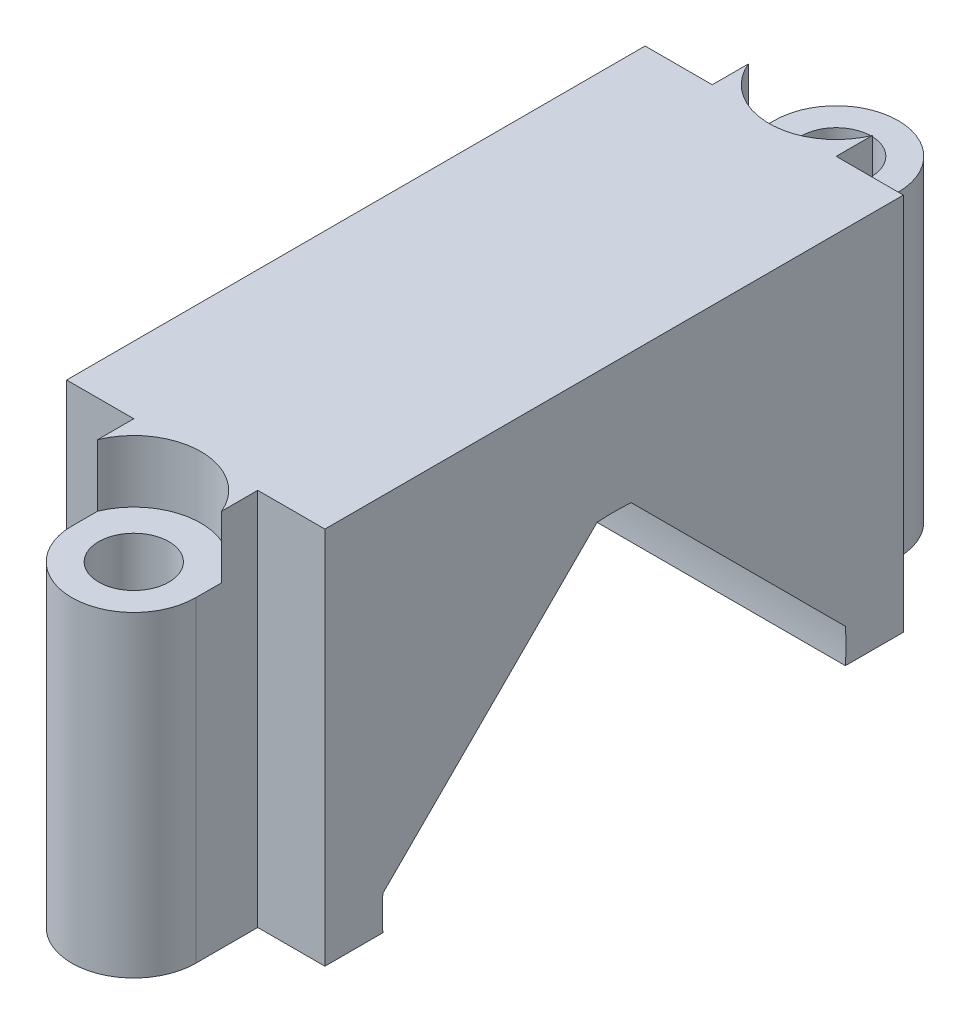
ISO-10303-21;
HEADER;
FILE_DESCRIPTION(('STEP AP214'),'2;1');
FILE_NAME('part.step','',(''),(''),'','','');
FILE_SCHEMA(('AUTOMOTIVE_DESIGN { 1 0 10303 214 1 1 1 1 }'));
ENDSEC;
DATA;
#1=APPLICATION_CONTEXT('core data for automotive mechanical design processes');
#2=APPLICATION_PROTOCOL_DEFINITION('international standard','automotive_design',2000,#1);
#3=PRODUCT_CONTEXT('',#1,'mechanical');
#4=PRODUCT('Part','Part','',(#3));
#5=PRODUCT_RELATED_PRODUCT_CATEGORY('part','',(#4));
#6=PRODUCT_DEFINITION_FORMATION('','',#4);
#7=PRODUCT_DEFINITION_CONTEXT('part definition',#1,'design');
#8=PRODUCT_DEFINITION('design','',#6,#7);
#9=PRODUCT_DEFINITION_SHAPE('','',#8);
#10=(LENGTH_UNIT() NAMED_UNIT(*) SI_UNIT(.MILLI.,.METRE.));
#11=(NAMED_UNIT(*) PLANE_ANGLE_UNIT() SI_UNIT($,.RADIAN.));
#12=(NAMED_UNIT(*) SI_UNIT($,.STERADIAN.) SOLID_ANGLE_UNIT());
#13=UNCERTAINTY_MEASURE_WITH_UNIT(LENGTH_MEASURE(1.E-05),#10,'distance_accuracy_value','');
#14=(GEOMETRIC_REPRESENTATION_CONTEXT(3) GLOBAL_UNCERTAINTY_ASSIGNED_CONTEXT((#13)) GLOBAL_UNIT_ASSIGNED_CONTEXT((#10,
#11,#12)) REPRESENTATION_CONTEXT('',''));
#15=CARTESIAN_POINT('',(0.,0.,0.));
#16=DIRECTION('',(0.,0.,1.));
#17=DIRECTION('',(1.,0.,0.));
#18=AXIS2_PLACEMENT_3D('',#15,#16,#17);
#19=CARTESIAN_POINT('',(0.,11.673732838335,0.));
#20=DIRECTION('',(0.,1.,0.));
#21=DIRECTION('',(0.,0.,1.));
#22=AXIS2_PLACEMENT_3D('',#19,#20,#21);
#23=PLANE('',#22);
#24=CARTESIAN_POINT('',(-58.75,11.673732838335,-40.75));
#25=DIRECTION('',(0.,1.,0.));
#26=DIRECTION('',(0.,0.,1.));
#27=AXIS2_PLACEMENT_3D('',#24,#25,#26);
#28=CIRCLE('',#27,1.69999999999999);
#29=CARTESIAN_POINT('',(-58.75,11.673732838335,-39.05));
#30=VERTEX_POINT('',#29);
#31=EDGE_CURVE('E46',#30,#30,#28,.T.);
#32=ORIENTED_EDGE('',*,*,#31,.T.);
#33=EDGE_LOOP('',(#32));
#34=FACE_BOUND('',#33,.T.);
#35=DIRECTION('',(0.,0.,1.));
#36=VECTOR('',#35,1.);
#37=CARTESIAN_POINT('',(-52.5,11.673732838335,0.));
#38=LINE('',#37,#36);
#39=CARTESIAN_POINT('',(-52.5,11.673732838335,-46.5554518814936));
#40=VERTEX_POINT('',#39);
#41=CARTESIAN_POINT('',(-52.5,11.673732838335,-43.75));
#42=VERTEX_POINT('',#41);
#43=EDGE_CURVE('E281',#40,#42,#38,.T.);
#44=ORIENTED_EDGE('',*,*,#43,.T.);
#45=DIRECTION('',(1.,0.,0.));
#46=VECTOR('',#45,1.);
#47=CARTESIAN_POINT('',(0.,11.673732838335,-43.75));
#48=LINE('',#47,#46);
#49=CARTESIAN_POINT('',(-55.75,11.673732838335,-43.75));
#50=VERTEX_POINT('',#49);
#51=EDGE_CURVE('E294',#50,#42,#48,.T.);
#52=ORIENTED_EDGE('',*,*,#51,.F.);
#53=DIRECTION('',(0.,0.,-1.));
#54=VECTOR('',#53,1.);
#55=CARTESIAN_POINT('',(-55.75,11.673732838335,0.));
#56=LINE('',#55,#54);
#57=CARTESIAN_POINT('',(-55.75,11.673732838335,-40.75));
#58=VERTEX_POINT('',#57);
#59=EDGE_CURVE('E292',#58,#50,#56,.T.);
#60=ORIENTED_EDGE('',*,*,#59,.F.);
#61=CARTESIAN_POINT('',(-58.75,11.673732838335,-40.75));
#62=DIRECTION('',(0.,1.,0.));
#63=DIRECTION('',(0.,0.,1.));
#64=AXIS2_PLACEMENT_3D('',#61,#62,#63);
#65=CIRCLE('',#64,3.);
#66=CARTESIAN_POINT('',(-61.75,11.673732838335,-40.75));
#67=VERTEX_POINT('',#66);
#68=EDGE_CURVE('E289',#67,#58,#65,.T.);
#69=ORIENTED_EDGE('',*,*,#68,.F.);
#70=DIRECTION('',(0.,0.,1.));
#71=VECTOR('',#70,1.);
#72=CARTESIAN_POINT('',(-61.75,11.673732838335,0.));
#73=LINE('',#72,#71);
#74=CARTESIAN_POINT('',(-61.75,11.673732838335,-43.75));
#75=VERTEX_POINT('',#74);
#76=EDGE_CURVE('E286',#75,#67,#73,.T.);
#77=ORIENTED_EDGE('',*,*,#76,.F.);
#78=DIRECTION('',(1.,0.,0.));
#79=VECTOR('',#78,1.);
#80=CARTESIAN_POINT('',(0.,11.673732838335,-43.75));
#81=LINE('',#80,#79);
#82=CARTESIAN_POINT('',(-65.,11.673732838335,-43.75));
#83=VERTEX_POINT('',#82);
#84=EDGE_CURVE('E268',#83,#75,#81,.T.);
#85=ORIENTED_EDGE('',*,*,#84,.F.);
#86=DIRECTION('',(0.,0.,1.));
#87=VECTOR('',#86,1.);
#88=CARTESIAN_POINT('',(-65.,11.673732838335,0.));
#89=LINE('',#88,#87);
#90=CARTESIAN_POINT('',(-65.,11.673732838335,-46.5554518814936));
#91=VERTEX_POINT('',#90);
#92=EDGE_CURVE('E269',#91,#83,#89,.T.);
#93=ORIENTED_EDGE('',*,*,#92,.F.);
#94=DIRECTION('',(-1.,0.,0.));
#95=VECTOR('',#94,1.);
#96=CARTESIAN_POINT('',(-45.07,11.673732838335,-46.5554518814936));
#97=LINE('',#96,#95);
#98=EDGE_CURVE('E338',#40,#91,#97,.T.);
#99=ORIENTED_EDGE('',*,*,#98,.F.);
#100=EDGE_LOOP('',(#44,#52,#60,#69,#77,#85,#93,#99));
#101=FACE_BOUND('',#100,.T.);
#102=ADVANCED_FACE('F42',(#34,#101),#23,.F.);
#103=CARTESIAN_POINT('',(-58.75,11.673732838335,-74.75));
#104=DIRECTION('',(0.,1.,0.));
#105=DIRECTION('',(0.,0.,1.));
#106=AXIS2_PLACEMENT_3D('',#103,#104,#105);
#107=CIRCLE('',#106,1.69999999999999);
#108=CARTESIAN_POINT('',(-58.75,11.673732838335,-73.05));
#109=VERTEX_POINT('',#108);
#110=EDGE_CURVE('E300',#109,#109,#107,.T.);
#111=ORIENTED_EDGE('',*,*,#110,.T.);
#112=EDGE_LOOP('',(#111));
#113=FACE_BOUND('',#112,.T.);
#114=CARTESIAN_POINT('',(-52.5,11.673732838335,-71.75));
#115=VERTEX_POINT('',#114);
#116=CARTESIAN_POINT('',(-52.5,11.673732838335,-68.9445481185063));
#117=VERTEX_POINT('',#116);
#118=EDGE_CURVE('E284',#115,#117,#38,.T.);
#119=ORIENTED_EDGE('',*,*,#118,.T.);
#120=DIRECTION('',(-1.,0.,0.));
#121=VECTOR('',#120,1.);
#122=CARTESIAN_POINT('',(-60.94,11.673732838335,-68.9445481185063));
#123=LINE('',#122,#121);
#124=CARTESIAN_POINT('',(-65.,11.673732838335,-68.9445481185063));
#125=VERTEX_POINT('',#124);
#126=EDGE_CURVE('E261',#117,#125,#123,.T.);
#127=ORIENTED_EDGE('',*,*,#126,.T.);
#128=CARTESIAN_POINT('',(-65.,11.673732838335,-71.75));
#129=VERTEX_POINT('',#128);
#130=EDGE_CURVE('E266',#129,#125,#89,.T.);
#131=ORIENTED_EDGE('',*,*,#130,.F.);
#132=DIRECTION('',(1.,0.,0.));
#133=VECTOR('',#132,1.);
#134=CARTESIAN_POINT('',(0.,11.673732838335,-71.75));
#135=LINE('',#134,#133);
#136=CARTESIAN_POINT('',(-61.75,11.673732838335,-71.75));
#137=VERTEX_POINT('',#136);
#138=EDGE_CURVE('E265',#129,#137,#135,.T.);
#139=ORIENTED_EDGE('',*,*,#138,.T.);
#140=DIRECTION('',(0.,0.,1.));
#141=VECTOR('',#140,1.);
#142=CARTESIAN_POINT('',(-61.75,11.673732838335,0.));
#143=LINE('',#142,#141);
#144=CARTESIAN_POINT('',(-61.75,11.673732838335,-74.75));
#145=VERTEX_POINT('',#144);
#146=EDGE_CURVE('E273',#145,#137,#143,.T.);
#147=ORIENTED_EDGE('',*,*,#146,.F.);
#148=CARTESIAN_POINT('',(-58.75,11.673732838335,-74.75));
#149=DIRECTION('',(0.,1.,0.));
#150=DIRECTION('',(0.,0.,1.));
#151=AXIS2_PLACEMENT_3D('',#148,#149,#150);
#152=CIRCLE('',#151,3.);
#153=CARTESIAN_POINT('',(-55.75,11.673732838335,-74.75));
#154=VERTEX_POINT('',#153);
#155=EDGE_CURVE('E275',#154,#145,#152,.T.);
#156=ORIENTED_EDGE('',*,*,#155,.F.);
#157=DIRECTION('',(0.,0.,-1.));
#158=VECTOR('',#157,1.);
#159=CARTESIAN_POINT('',(-55.75,11.673732838335,0.));
#160=LINE('',#159,#158);
#161=CARTESIAN_POINT('',(-55.75,11.673732838335,-71.75));
#162=VERTEX_POINT('',#161);
#163=EDGE_CURVE('E260',#162,#154,#160,.T.);
#164=ORIENTED_EDGE('',*,*,#163,.F.);
#165=DIRECTION('',(1.,0.,0.));
#166=VECTOR('',#165,1.);
#167=CARTESIAN_POINT('',(0.,11.673732838335,-71.75));
#168=LINE('',#167,#166);
#169=EDGE_CURVE('E272',#162,#115,#168,.T.);
#170=ORIENTED_EDGE('',*,*,#169,.T.);
#171=EDGE_LOOP('',(#119,#127,#131,#139,#147,#156,#164,#170));
#172=FACE_BOUND('',#171,.T.);
#173=ADVANCED_FACE('F44',(#113,#172),#23,.F.);
#174=CARTESIAN_POINT('',(-52.5,71.9076365356005,0.));
#175=DIRECTION('',(1.,0.,0.));
#176=DIRECTION('',(0.,0.,-1.));
#177=AXIS2_PLACEMENT_3D('',#174,#175,#176);
#178=PLANE('',#177);
#179=ORIENTED_EDGE('',*,*,#118,.F.);
#180=DIRECTION('',(0.,-1.,0.));
#181=VECTOR('',#180,1.);
#182=CARTESIAN_POINT('',(-52.5,71.9076365356005,-71.75));
#183=LINE('',#182,#181);
#184=CARTESIAN_POINT('',(-52.5,30.,-71.75));
#185=VERTEX_POINT('',#184);
#186=EDGE_CURVE('E225',#185,#115,#183,.T.);
#187=ORIENTED_EDGE('',*,*,#186,.F.);
#188=DIRECTION('',(0.,0.,1.));
#189=VECTOR('',#188,1.);
#190=CARTESIAN_POINT('',(-52.5,30.,0.));
#191=LINE('',#190,#189);
#192=CARTESIAN_POINT('',(-52.5,30.,-43.75));
#193=VERTEX_POINT('',#192);
#194=EDGE_CURVE('E221',#185,#193,#191,.T.);
#195=ORIENTED_EDGE('',*,*,#194,.T.);
#196=DIRECTION('',(0.,-1.,0.));
#197=VECTOR('',#196,1.);
#198=CARTESIAN_POINT('',(-52.5,71.9076365356005,-43.75));
#199=LINE('',#198,#197);
#200=EDGE_CURVE('E224',#193,#42,#199,.T.);
#201=ORIENTED_EDGE('',*,*,#200,.T.);
#202=ORIENTED_EDGE('',*,*,#43,.F.);
#203=CARTESIAN_POINT('',(-52.5,12.5,-57.75));
#204=DIRECTION('',(1.,0.,0.));
#205=DIRECTION('',(0.,0.,-1.));
#206=AXIS2_PLACEMENT_3D('',#203,#204,#205);
#207=CIRCLE('',#206,11.225);
#208=CARTESIAN_POINT('',(-52.5,13.3262671616649,-46.5554518814936));
#209=VERTEX_POINT('',#208);
#210=EDGE_CURVE('E359',#40,#209,#207,.F.);
#211=ORIENTED_EDGE('',*,*,#210,.T.);
#212=DIRECTION('',(0.,0.707106781186547,-0.707106781186548));
#213=VECTOR('',#212,1.);
#214=CARTESIAN_POINT('',(-52.5,19.3392259078859,-52.5684106277146));
#215=LINE('',#214,#213);
#216=CARTESIAN_POINT('',(-52.5,23.6945481185063,-56.923732838335));
#217=VERTEX_POINT('',#216);
#218=EDGE_CURVE('E257',#209,#217,#215,.T.);
#219=ORIENTED_EDGE('',*,*,#218,.T.);
#220=CARTESIAN_POINT('',(-52.5,23.6945481185064,-58.576267161665));
#221=VERTEX_POINT('',#220);
#222=EDGE_CURVE('E358',#217,#221,#207,.F.);
#223=ORIENTED_EDGE('',*,*,#222,.T.);
#224=DIRECTION('',(0.,0.707106781186548,0.707106781186548));
#225=VECTOR('',#224,1.);
#226=CARTESIAN_POINT('',(-52.5,77.0892259078859,-5.18158937228538));
#227=LINE('',#226,#225);
#228=CARTESIAN_POINT('',(-52.5,13.326267161665,-68.9445481185063));
#229=VERTEX_POINT('',#228);
#230=EDGE_CURVE('E255',#229,#221,#227,.T.);
#231=ORIENTED_EDGE('',*,*,#230,.F.);
#232=EDGE_CURVE('E352',#229,#117,#207,.F.);
#233=ORIENTED_EDGE('',*,*,#232,.T.);
#234=EDGE_LOOP('',(#179,#187,#195,#201,#202,#211,#219,#223,#231,#233));
#235=FACE_BOUND('',#234,.T.);
#236=ADVANCED_FACE('F393',(#235),#178,.T.);
#237=CARTESIAN_POINT('',(0.,30.,0.));
#238=DIRECTION('',(0.,1.,0.));
#239=DIRECTION('',(0.,0.,1.));
#240=AXIS2_PLACEMENT_3D('',#237,#238,#239);
#241=PLANE('',#240);
#242=CARTESIAN_POINT('',(-58.75,30.,-40.75));
#243=DIRECTION('',(0.,1.,0.));
#244=DIRECTION('',(0.,0.,1.));
#245=AXIS2_PLACEMENT_3D('',#242,#243,#244);
#246=CIRCLE('',#245,3.25);
#247=CARTESIAN_POINT('',(-55.75,30.,-42.));
#248=VERTEX_POINT('',#247);
#249=CARTESIAN_POINT('',(-61.75,30.,-42.));
#250=VERTEX_POINT('',#249);
#251=EDGE_CURVE('E58',#248,#250,#246,.T.);
#252=ORIENTED_EDGE('',*,*,#251,.F.);
#253=DIRECTION('',(0.,0.,-1.));
#254=VECTOR('',#253,1.);
#255=CARTESIAN_POINT('',(-55.75,30.,0.));
#256=LINE('',#255,#254);
#257=CARTESIAN_POINT('',(-55.75,30.,-43.75));
#258=VERTEX_POINT('',#257);
#259=EDGE_CURVE('E204',#248,#258,#256,.T.);
#260=ORIENTED_EDGE('',*,*,#259,.T.);
#261=DIRECTION('',(1.,0.,0.));
#262=VECTOR('',#261,1.);
#263=CARTESIAN_POINT('',(0.,30.,-43.75));
#264=LINE('',#263,#262);
#265=EDGE_CURVE('E213',#258,#193,#264,.T.);
#266=ORIENTED_EDGE('',*,*,#265,.T.);
#267=ORIENTED_EDGE('',*,*,#194,.F.);
#268=DIRECTION('',(1.,0.,0.));
#269=VECTOR('',#268,1.);
#270=CARTESIAN_POINT('',(0.,30.,-71.75));
#271=LINE('',#270,#269);
#272=CARTESIAN_POINT('',(-55.75,30.,-71.75));
#273=VERTEX_POINT('',#272);
#274=EDGE_CURVE('E215',#273,#185,#271,.T.);
#275=ORIENTED_EDGE('',*,*,#274,.F.);
#276=DIRECTION('',(0.,0.,-1.));
#277=VECTOR('',#276,1.);
#278=CARTESIAN_POINT('',(-55.75,30.,0.));
#279=LINE('',#278,#277);
#280=CARTESIAN_POINT('',(-55.75,30.,-73.5));
#281=VERTEX_POINT('',#280);
#282=EDGE_CURVE('E362',#273,#281,#279,.T.);
#283=ORIENTED_EDGE('',*,*,#282,.T.);
#284=CARTESIAN_POINT('',(-58.75,30.,-74.75));
#285=DIRECTION('',(0.,1.,0.));
#286=DIRECTION('',(0.,0.,1.));
#287=AXIS2_PLACEMENT_3D('',#284,#285,#286);
#288=CIRCLE('',#287,3.25);
#289=CARTESIAN_POINT('',(-61.75,30.,-73.5));
#290=VERTEX_POINT('',#289);
#291=EDGE_CURVE('E66',#290,#281,#288,.T.);
#292=ORIENTED_EDGE('',*,*,#291,.F.);
#293=DIRECTION('',(0.,0.,1.));
#294=VECTOR('',#293,1.);
#295=CARTESIAN_POINT('',(-61.75,30.,0.));
#296=LINE('',#295,#294);
#297=CARTESIAN_POINT('',(-61.75,30.,-71.75));
#298=VERTEX_POINT('',#297);
#299=EDGE_CURVE('E365',#290,#298,#296,.T.);
#300=ORIENTED_EDGE('',*,*,#299,.T.);
#301=DIRECTION('',(1.,0.,0.));
#302=VECTOR('',#301,1.);
#303=CARTESIAN_POINT('',(0.,30.,-71.75));
#304=LINE('',#303,#302);
#305=CARTESIAN_POINT('',(-65.,30.,-71.75));
#306=VERTEX_POINT('',#305);
#307=EDGE_CURVE('E234',#306,#298,#304,.T.);
#308=ORIENTED_EDGE('',*,*,#307,.F.);
#309=DIRECTION('',(0.,0.,1.));
#310=VECTOR('',#309,1.);
#311=CARTESIAN_POINT('',(-65.,30.,0.));
#312=LINE('',#311,#310);
#313=CARTESIAN_POINT('',(-65.,30.,-43.75));
#314=VERTEX_POINT('',#313);
#315=EDGE_CURVE('E367',#306,#314,#312,.T.);
#316=ORIENTED_EDGE('',*,*,#315,.T.);
#317=DIRECTION('',(1.,0.,0.));
#318=VECTOR('',#317,1.);
#319=CARTESIAN_POINT('',(0.,30.,-43.75));
#320=LINE('',#319,#318);
#321=CARTESIAN_POINT('',(-61.75,30.,-43.75));
#322=VERTEX_POINT('',#321);
#323=EDGE_CURVE('E217',#314,#322,#320,.T.);
#324=ORIENTED_EDGE('',*,*,#323,.T.);
#325=DIRECTION('',(0.,0.,1.));
#326=VECTOR('',#325,1.);
#327=CARTESIAN_POINT('',(-61.75,30.,0.));
#328=LINE('',#327,#326);
#329=EDGE_CURVE('E207',#322,#250,#328,.T.);
#330=ORIENTED_EDGE('',*,*,#329,.T.);
#331=EDGE_LOOP('',(#252,#260,#266,#267,#275,#283,#292,#300,#308,#316,#324,#330));
#332=FACE_BOUND('',#331,.T.);
#333=ADVANCED_FACE('F203',(#332),#241,.T.);
#334=CARTESIAN_POINT('',(0.,71.9076365356005,-71.75));
#335=DIRECTION('',(0.,0.,-1.));
#336=DIRECTION('',(-1.,0.,0.));
#337=AXIS2_PLACEMENT_3D('',#334,#335,#336);
#338=PLANE('',#337);
#339=ORIENTED_EDGE('',*,*,#169,.F.);
#340=DIRECTION('',(0.,-1.,0.));
#341=VECTOR('',#340,1.);
#342=CARTESIAN_POINT('',(-55.75,71.9076365356005,-71.75));
#343=LINE('',#342,#341);
#344=EDGE_CURVE('E228',#273,#162,#343,.T.);
#345=ORIENTED_EDGE('',*,*,#344,.F.);
#346=ORIENTED_EDGE('',*,*,#274,.T.);
#347=ORIENTED_EDGE('',*,*,#186,.T.);
#348=EDGE_LOOP('',(#339,#345,#346,#347));
#349=FACE_BOUND('',#348,.T.);
#350=ADVANCED_FACE('F397',(#349),#338,.T.);
#351=CARTESIAN_POINT('',(0.,71.9076365356005,-43.75));
#352=DIRECTION('',(0.,0.,-1.));
#353=DIRECTION('',(-1.,0.,0.));
#354=AXIS2_PLACEMENT_3D('',#351,#352,#353);
#355=PLANE('',#354);
#356=DIRECTION('',(0.,-1.,0.));
#357=VECTOR('',#356,1.);
#358=CARTESIAN_POINT('',(-55.75,71.9076365356005,-43.75));
#359=LINE('',#358,#357);
#360=EDGE_CURVE('E211',#258,#50,#359,.T.);
#361=ORIENTED_EDGE('',*,*,#360,.T.);
#362=ORIENTED_EDGE('',*,*,#51,.T.);
#363=ORIENTED_EDGE('',*,*,#200,.F.);
#364=ORIENTED_EDGE('',*,*,#265,.F.);
#365=EDGE_LOOP('',(#361,#362,#363,#364));
#366=FACE_BOUND('',#365,.T.);
#367=ADVANCED_FACE('F388',(#366),#355,.F.);
#368=CARTESIAN_POINT('',(-55.75,71.9076365356005,0.));
#369=DIRECTION('',(-1.,0.,0.));
#370=DIRECTION('',(0.,0.,1.));
#371=AXIS2_PLACEMENT_3D('',#368,#369,#370);
#372=PLANE('',#371);
#373=DIRECTION('',(0.,1.,0.));
#374=VECTOR('',#373,1.);
#375=CARTESIAN_POINT('',(-55.75,30.,-42.));
#376=LINE('',#375,#374);
#377=CARTESIAN_POINT('',(-55.75,27.,-42.));
#378=VERTEX_POINT('',#377);
#379=EDGE_CURVE('E191',#248,#378,#376,.F.);
#380=ORIENTED_EDGE('',*,*,#379,.T.);
#381=DIRECTION('',(0.,0.,1.));
#382=VECTOR('',#381,1.);
#383=CARTESIAN_POINT('',(-55.75,27.,0.));
#384=LINE('',#383,#382);
#385=CARTESIAN_POINT('',(-55.75,27.,-40.75));
#386=VERTEX_POINT('',#385);
#387=EDGE_CURVE('E311',#378,#386,#384,.T.);
#388=ORIENTED_EDGE('',*,*,#387,.T.);
#389=DIRECTION('',(0.,-1.,0.));
#390=VECTOR('',#389,1.);
#391=CARTESIAN_POINT('',(-55.75,71.9076365356005,-40.75));
#392=LINE('',#391,#390);
#393=EDGE_CURVE('E246',#386,#58,#392,.T.);
#394=ORIENTED_EDGE('',*,*,#393,.T.);
#395=ORIENTED_EDGE('',*,*,#59,.T.);
#396=ORIENTED_EDGE('',*,*,#360,.F.);
#397=ORIENTED_EDGE('',*,*,#259,.F.);
#398=EDGE_LOOP('',(#380,#388,#394,#395,#396,#397));
#399=FACE_BOUND('',#398,.T.);
#400=ADVANCED_FACE('F209',(#399),#372,.F.);
#401=CARTESIAN_POINT('',(-58.75,71.9076365356005,-40.75));
#402=DIRECTION('',(0.,-1.,0.));
#403=DIRECTION('',(0.,0.,-1.));
#404=AXIS2_PLACEMENT_3D('',#401,#402,#403);
#405=CYLINDRICAL_SURFACE('',#404,3.);
#406=ORIENTED_EDGE('',*,*,#393,.F.);
#407=CARTESIAN_POINT('',(-58.75,27.,-40.75));
#408=DIRECTION('',(0.,-1.,0.));
#409=DIRECTION('',(0.,0.,-1.));
#410=AXIS2_PLACEMENT_3D('',#407,#408,#409);
#411=CIRCLE('',#410,3.);
#412=CARTESIAN_POINT('',(-61.75,27.,-40.75));
#413=VERTEX_POINT('',#412);
#414=EDGE_CURVE('E198',#386,#413,#411,.T.);
#415=ORIENTED_EDGE('',*,*,#414,.T.);
#416=DIRECTION('',(0.,-1.,0.));
#417=VECTOR('',#416,1.);
#418=CARTESIAN_POINT('',(-61.75,71.9076365356005,-40.75));
#419=LINE('',#418,#417);
#420=EDGE_CURVE('E244',#413,#67,#419,.T.);
#421=ORIENTED_EDGE('',*,*,#420,.T.);
#422=ORIENTED_EDGE('',*,*,#68,.T.);
#423=EDGE_LOOP('',(#406,#415,#421,#422));
#424=FACE_BOUND('',#423,.T.);
#425=ADVANCED_FACE('F384',(#424),#405,.T.);
#426=CARTESIAN_POINT('',(-61.75,71.9076365356005,0.));
#427=DIRECTION('',(1.,0.,0.));
#428=DIRECTION('',(0.,0.,-1.));
#429=AXIS2_PLACEMENT_3D('',#426,#427,#428);
#430=PLANE('',#429);
#431=ORIENTED_EDGE('',*,*,#420,.F.);
#432=DIRECTION('',(0.,0.,-1.));
#433=VECTOR('',#432,1.);
#434=CARTESIAN_POINT('',(-61.75,27.,0.));
#435=LINE('',#434,#433);
#436=CARTESIAN_POINT('',(-61.75,27.,-42.));
#437=VERTEX_POINT('',#436);
#438=EDGE_CURVE('E11',#413,#437,#435,.T.);
#439=ORIENTED_EDGE('',*,*,#438,.T.);
#440=DIRECTION('',(0.,1.,0.));
#441=VECTOR('',#440,1.);
#442=CARTESIAN_POINT('',(-61.75,30.,-42.));
#443=LINE('',#442,#441);
#444=EDGE_CURVE('E51',#437,#250,#443,.T.);
#445=ORIENTED_EDGE('',*,*,#444,.T.);
#446=ORIENTED_EDGE('',*,*,#329,.F.);
#447=DIRECTION('',(0.,-1.,0.));
#448=VECTOR('',#447,1.);
#449=CARTESIAN_POINT('',(-61.75,71.9076365356005,-43.75));
#450=LINE('',#449,#448);
#451=EDGE_CURVE('E241',#322,#75,#450,.T.);
#452=ORIENTED_EDGE('',*,*,#451,.T.);
#453=ORIENTED_EDGE('',*,*,#76,.T.);
#454=EDGE_LOOP('',(#431,#439,#445,#446,#452,#453));
#455=FACE_BOUND('',#454,.T.);
#456=ADVANCED_FACE('F307',(#455),#430,.F.);
#457=CARTESIAN_POINT('',(0.,71.9076365356005,-43.75));
#458=DIRECTION('',(0.,0.,-1.));
#459=DIRECTION('',(-1.,0.,0.));
#460=AXIS2_PLACEMENT_3D('',#457,#458,#459);
#461=PLANE('',#460);
#462=DIRECTION('',(0.,-1.,0.));
#463=VECTOR('',#462,1.);
#464=CARTESIAN_POINT('',(-65.,71.9076365356005,-43.75));
#465=LINE('',#464,#463);
#466=EDGE_CURVE('E238',#314,#83,#465,.T.);
#467=ORIENTED_EDGE('',*,*,#466,.T.);
#468=ORIENTED_EDGE('',*,*,#84,.T.);
#469=ORIENTED_EDGE('',*,*,#451,.F.);
#470=ORIENTED_EDGE('',*,*,#323,.F.);
#471=EDGE_LOOP('',(#467,#468,#469,#470));
#472=FACE_BOUND('',#471,.T.);
#473=ADVANCED_FACE('F375',(#472),#461,.F.);
#474=CARTESIAN_POINT('',(-65.,71.9076365356005,0.));
#475=DIRECTION('',(1.,0.,0.));
#476=DIRECTION('',(0.,0.,-1.));
#477=AXIS2_PLACEMENT_3D('',#474,#475,#476);
#478=PLANE('',#477);
#479=DIRECTION('',(0.,-1.,0.));
#480=VECTOR('',#479,1.);
#481=CARTESIAN_POINT('',(-65.,71.9076365356005,-71.75));
#482=LINE('',#481,#480);
#483=EDGE_CURVE('E235',#306,#129,#482,.T.);
#484=ORIENTED_EDGE('',*,*,#483,.T.);
#485=ORIENTED_EDGE('',*,*,#130,.T.);
#486=CARTESIAN_POINT('',(-65.,12.5,-57.75));
#487=DIRECTION('',(1.,0.,0.));
#488=DIRECTION('',(0.,0.,-1.));
#489=AXIS2_PLACEMENT_3D('',#486,#487,#488);
#490=CIRCLE('',#489,11.225);
#491=EDGE_CURVE('E348',#125,#91,#490,.T.);
#492=ORIENTED_EDGE('',*,*,#491,.T.);
#493=ORIENTED_EDGE('',*,*,#92,.T.);
#494=ORIENTED_EDGE('',*,*,#466,.F.);
#495=ORIENTED_EDGE('',*,*,#315,.F.);
#496=EDGE_LOOP('',(#484,#485,#492,#493,#494,#495));
#497=FACE_BOUND('',#496,.T.);
#498=ADVANCED_FACE('F413',(#497),#478,.F.);
#499=CARTESIAN_POINT('',(0.,71.9076365356005,-71.75));
#500=DIRECTION('',(0.,0.,-1.));
#501=DIRECTION('',(-1.,0.,0.));
#502=AXIS2_PLACEMENT_3D('',#499,#500,#501);
#503=PLANE('',#502);
#504=ORIENTED_EDGE('',*,*,#138,.F.);
#505=ORIENTED_EDGE('',*,*,#483,.F.);
#506=ORIENTED_EDGE('',*,*,#307,.T.);
#507=DIRECTION('',(0.,-1.,0.));
#508=VECTOR('',#507,1.);
#509=CARTESIAN_POINT('',(-61.75,71.9076365356005,-71.75));
#510=LINE('',#509,#508);
#511=EDGE_CURVE('E231',#298,#137,#510,.T.);
#512=ORIENTED_EDGE('',*,*,#511,.T.);
#513=EDGE_LOOP('',(#504,#505,#506,#512));
#514=FACE_BOUND('',#513,.T.);
#515=ADVANCED_FACE('F410',(#514),#503,.T.);
#516=CARTESIAN_POINT('',(-61.75,71.9076365356005,0.));
#517=DIRECTION('',(1.,0.,0.));
#518=DIRECTION('',(0.,0.,-1.));
#519=AXIS2_PLACEMENT_3D('',#516,#517,#518);
#520=PLANE('',#519);
#521=DIRECTION('',(0.,1.,0.));
#522=VECTOR('',#521,1.);
#523=CARTESIAN_POINT('',(-61.75,30.,-73.5));
#524=LINE('',#523,#522);
#525=CARTESIAN_POINT('',(-61.75,27.,-73.5));
#526=VERTEX_POINT('',#525);
#527=EDGE_CURVE('E325',#290,#526,#524,.F.);
#528=ORIENTED_EDGE('',*,*,#527,.T.);
#529=DIRECTION('',(0.,0.,-1.));
#530=VECTOR('',#529,1.);
#531=CARTESIAN_POINT('',(-61.75,27.,0.));
#532=LINE('',#531,#530);
#533=CARTESIAN_POINT('',(-61.75,27.,-74.75));
#534=VERTEX_POINT('',#533);
#535=EDGE_CURVE('E304',#526,#534,#532,.T.);
#536=ORIENTED_EDGE('',*,*,#535,.T.);
#537=DIRECTION('',(0.,-1.,0.));
#538=VECTOR('',#537,1.);
#539=CARTESIAN_POINT('',(-61.75,71.9076365356005,-74.75));
#540=LINE('',#539,#538);
#541=EDGE_CURVE('E229',#534,#145,#540,.T.);
#542=ORIENTED_EDGE('',*,*,#541,.T.);
#543=ORIENTED_EDGE('',*,*,#146,.T.);
#544=ORIENTED_EDGE('',*,*,#511,.F.);
#545=ORIENTED_EDGE('',*,*,#299,.F.);
#546=EDGE_LOOP('',(#528,#536,#542,#543,#544,#545));
#547=FACE_BOUND('',#546,.T.);
#548=ADVANCED_FACE('F406',(#547),#520,.F.);
#549=CARTESIAN_POINT('',(-58.75,71.9076365356005,-74.75));
#550=DIRECTION('',(0.,-1.,0.));
#551=DIRECTION('',(0.,0.,-1.));
#552=AXIS2_PLACEMENT_3D('',#549,#550,#551);
#553=CYLINDRICAL_SURFACE('',#552,3.);
#554=ORIENTED_EDGE('',*,*,#541,.F.);
#555=CARTESIAN_POINT('',(-58.75,27.,-74.75));
#556=DIRECTION('',(0.,-1.,0.));
#557=DIRECTION('',(0.,0.,-1.));
#558=AXIS2_PLACEMENT_3D('',#555,#556,#557);
#559=CIRCLE('',#558,3.);
#560=CARTESIAN_POINT('',(-55.75,27.,-74.75));
#561=VERTEX_POINT('',#560);
#562=EDGE_CURVE('E328',#534,#561,#559,.T.);
#563=ORIENTED_EDGE('',*,*,#562,.T.);
#564=DIRECTION('',(0.,-1.,0.));
#565=VECTOR('',#564,1.);
#566=CARTESIAN_POINT('',(-55.75,71.9076365356005,-74.75));
#567=LINE('',#566,#565);
#568=EDGE_CURVE('E226',#561,#154,#567,.T.);
#569=ORIENTED_EDGE('',*,*,#568,.T.);
#570=ORIENTED_EDGE('',*,*,#155,.T.);
#571=EDGE_LOOP('',(#554,#563,#569,#570));
#572=FACE_BOUND('',#571,.T.);
#573=ADVANCED_FACE('F619',(#572),#553,.T.);
#574=CARTESIAN_POINT('',(-55.75,71.9076365356005,0.));
#575=DIRECTION('',(-1.,0.,0.));
#576=DIRECTION('',(0.,0.,1.));
#577=AXIS2_PLACEMENT_3D('',#574,#575,#576);
#578=PLANE('',#577);
#579=ORIENTED_EDGE('',*,*,#568,.F.);
#580=DIRECTION('',(0.,0.,1.));
#581=VECTOR('',#580,1.);
#582=CARTESIAN_POINT('',(-55.75,27.,0.));
#583=LINE('',#582,#581);
#584=CARTESIAN_POINT('',(-55.75,27.,-73.5));
#585=VERTEX_POINT('',#584);
#586=EDGE_CURVE('E297',#561,#585,#583,.T.);
#587=ORIENTED_EDGE('',*,*,#586,.T.);
#588=DIRECTION('',(0.,1.,0.));
#589=VECTOR('',#588,1.);
#590=CARTESIAN_POINT('',(-55.75,30.,-73.5));
#591=LINE('',#590,#589);
#592=EDGE_CURVE('E264',#585,#281,#591,.T.);
#593=ORIENTED_EDGE('',*,*,#592,.T.);
#594=ORIENTED_EDGE('',*,*,#282,.F.);
#595=ORIENTED_EDGE('',*,*,#344,.T.);
#596=ORIENTED_EDGE('',*,*,#163,.T.);
#597=EDGE_LOOP('',(#579,#587,#593,#594,#595,#596));
#598=FACE_BOUND('',#597,.T.);
#599=ADVANCED_FACE('F401',(#598),#578,.F.);
#600=CARTESIAN_POINT('',(-60.94,12.5,-57.75));
#601=DIRECTION('',(1.,0.,0.));
#602=DIRECTION('',(0.,0.,-1.));
#603=AXIS2_PLACEMENT_3D('',#600,#601,#602);
#604=PLANE('',#603);
#605=CARTESIAN_POINT('',(-60.94,12.5,-57.75));
#606=DIRECTION('',(1.,0.,0.));
#607=DIRECTION('',(0.,0.,-1.));
#608=AXIS2_PLACEMENT_3D('',#605,#606,#607);
#609=CIRCLE('',#608,11.225);
#610=CARTESIAN_POINT('',(-60.94,13.3262671616649,-68.9445481185063));
#611=VERTEX_POINT('',#610);
#612=CARTESIAN_POINT('',(-60.94,23.6945481185064,-58.576267161665));
#613=VERTEX_POINT('',#612);
#614=EDGE_CURVE('E349',#611,#613,#609,.T.);
#615=ORIENTED_EDGE('',*,*,#614,.F.);
#616=DIRECTION('',(0.,-0.707106781186548,-0.707106781186548));
#617=VECTOR('',#616,1.);
#618=CARTESIAN_POINT('',(-60.94,18.5104076400856,-63.7604076400856));
#619=LINE('',#618,#617);
#620=EDGE_CURVE('E303',#613,#611,#619,.T.);
#621=ORIENTED_EDGE('',*,*,#620,.F.);
#622=EDGE_LOOP('',(#615,#621));
#623=FACE_BOUND('',#622,.T.);
#624=ADVANCED_FACE('F435',(#623),#604,.F.);
#625=CARTESIAN_POINT('',(-60.94,12.5,-57.75));
#626=DIRECTION('',(-1.,0.,0.));
#627=DIRECTION('',(0.,0.,1.));
#628=AXIS2_PLACEMENT_3D('',#625,#626,#627);
#629=CYLINDRICAL_SURFACE('',#628,11.225);
#630=ORIENTED_EDGE('',*,*,#126,.F.);
#631=ORIENTED_EDGE('',*,*,#232,.F.);
#632=DIRECTION('',(-1.,0.,0.));
#633=VECTOR('',#632,1.);
#634=CARTESIAN_POINT('',(-45.07,13.326267161665,-68.9445481185063));
#635=LINE('',#634,#633);
#636=EDGE_CURVE('E346',#229,#611,#635,.T.);
#637=ORIENTED_EDGE('',*,*,#636,.T.);
#638=ORIENTED_EDGE('',*,*,#614,.T.);
#639=DIRECTION('',(-1.,0.,0.));
#640=VECTOR('',#639,1.);
#641=CARTESIAN_POINT('',(-45.07,23.6945481185064,-58.576267161665));
#642=LINE('',#641,#640);
#643=EDGE_CURVE('E344',#221,#613,#642,.T.);
#644=ORIENTED_EDGE('',*,*,#643,.F.);
#645=ORIENTED_EDGE('',*,*,#222,.F.);
#646=DIRECTION('',(-1.,0.,0.));
#647=VECTOR('',#646,1.);
#648=CARTESIAN_POINT('',(-45.07,23.6945481185063,-56.923732838335));
#649=LINE('',#648,#647);
#650=CARTESIAN_POINT('',(-60.94,23.6945481185063,-56.923732838335));
#651=VERTEX_POINT('',#650);
#652=EDGE_CURVE('E342',#217,#651,#649,.T.);
#653=ORIENTED_EDGE('',*,*,#652,.T.);
#654=CARTESIAN_POINT('',(-60.94,13.3262671616649,-46.5554518814936));
#655=VERTEX_POINT('',#654);
#656=EDGE_CURVE('E353',#651,#655,#609,.T.);
#657=ORIENTED_EDGE('',*,*,#656,.T.);
#658=DIRECTION('',(-1.,0.,0.));
#659=VECTOR('',#658,1.);
#660=CARTESIAN_POINT('',(-45.07,13.3262671616649,-46.5554518814936));
#661=LINE('',#660,#659);
#662=EDGE_CURVE('E340',#209,#655,#661,.T.);
#663=ORIENTED_EDGE('',*,*,#662,.F.);
#664=ORIENTED_EDGE('',*,*,#210,.F.);
#665=ORIENTED_EDGE('',*,*,#98,.T.);
#666=ORIENTED_EDGE('',*,*,#491,.F.);
#667=EDGE_LOOP('',(#630,#631,#637,#638,#644,#645,#653,#657,#663,#664,#665,#666));
#668=FACE_BOUND('',#667,.T.);
#669=ADVANCED_FACE('F420',(#668),#629,.F.);
#670=DIRECTION('',(0.,-0.707106781186547,0.707106781186548));
#671=VECTOR('',#670,1.);
#672=CARTESIAN_POINT('',(-60.94,18.5104076400856,-51.7395923599143));
#673=LINE('',#672,#671);
#674=EDGE_CURVE('E335',#651,#655,#673,.T.);
#675=ORIENTED_EDGE('',*,*,#674,.T.);
#676=ORIENTED_EDGE('',*,*,#656,.F.);
#677=EDGE_LOOP('',(#675,#676));
#678=FACE_BOUND('',#677,.T.);
#679=ADVANCED_FACE('F431',(#678),#604,.F.);
#680=CARTESIAN_POINT('',(-45.07,18.5104076400856,-63.7604076400856));
#681=DIRECTION('',(0.,0.707106781186547,-0.707106781186547));
#682=DIRECTION('',(0.,0.707106781186548,0.707106781186548));
#683=AXIS2_PLACEMENT_3D('',#680,#681,#682);
#684=PLANE('',#683);
#685=ORIENTED_EDGE('',*,*,#230,.T.);
#686=ORIENTED_EDGE('',*,*,#643,.T.);
#687=ORIENTED_EDGE('',*,*,#620,.T.);
#688=ORIENTED_EDGE('',*,*,#636,.F.);
#689=EDGE_LOOP('',(#685,#686,#687,#688));
#690=FACE_BOUND('',#689,.T.);
#691=ADVANCED_FACE('F433',(#690),#684,.F.);
#692=CARTESIAN_POINT('',(-45.07,18.5104076400856,-51.7395923599143));
#693=DIRECTION('',(0.,-0.707106781186548,-0.707106781186547));
#694=DIRECTION('',(0.,0.707106781186547,-0.707106781186548));
#695=AXIS2_PLACEMENT_3D('',#692,#693,#694);
#696=PLANE('',#695);
#697=ORIENTED_EDGE('',*,*,#662,.T.);
#698=ORIENTED_EDGE('',*,*,#674,.F.);
#699=ORIENTED_EDGE('',*,*,#652,.F.);
#700=ORIENTED_EDGE('',*,*,#218,.F.);
#701=EDGE_LOOP('',(#697,#698,#699,#700));
#702=FACE_BOUND('',#701,.T.);
#703=ADVANCED_FACE('F428',(#702),#696,.T.);
#704=CARTESIAN_POINT('',(-58.75,30.,-74.75));
#705=DIRECTION('',(0.,1.,0.));
#706=DIRECTION('',(0.,0.,1.));
#707=AXIS2_PLACEMENT_3D('',#704,#705,#706);
#708=CYLINDRICAL_SURFACE('',#707,1.69999999999999);
#709=CARTESIAN_POINT('',(-58.75,27.,-74.75));
#710=DIRECTION('',(0.,1.,0.));
#711=DIRECTION('',(0.,0.,1.));
#712=AXIS2_PLACEMENT_3D('',#709,#710,#711);
#713=CIRCLE('',#712,1.69999999999999);
#714=CARTESIAN_POINT('',(-58.75,27.,-73.05));
#715=VERTEX_POINT('',#714);
#716=EDGE_CURVE('E322',#715,#715,#713,.T.);
#717=ORIENTED_EDGE('',*,*,#716,.T.);
#718=EDGE_LOOP('',(#717));
#719=FACE_BOUND('',#718,.T.);
#720=ORIENTED_EDGE('',*,*,#110,.F.);
#721=EDGE_LOOP('',(#720));
#722=FACE_BOUND('',#721,.T.);
#723=ADVANCED_FACE('F471',(#719,#722),#708,.F.);
#724=CARTESIAN_POINT('',(-57.05,27.,-74.75));
#725=DIRECTION('',(0.,-1.,0.));
#726=DIRECTION('',(0.,0.,-1.));
#727=AXIS2_PLACEMENT_3D('',#724,#725,#726);
#728=PLANE('',#727);
#729=ORIENTED_EDGE('',*,*,#716,.F.);
#730=EDGE_LOOP('',(#729));
#731=FACE_BOUND('',#730,.T.);
#732=CARTESIAN_POINT('',(-58.75,27.,-74.75));
#733=DIRECTION('',(0.,1.,0.));
#734=DIRECTION('',(0.,0.,1.));
#735=AXIS2_PLACEMENT_3D('',#732,#733,#734);
#736=CIRCLE('',#735,3.25);
#737=EDGE_CURVE('E319',#526,#585,#736,.T.);
#738=ORIENTED_EDGE('',*,*,#737,.T.);
#739=ORIENTED_EDGE('',*,*,#586,.F.);
#740=ORIENTED_EDGE('',*,*,#562,.F.);
#741=ORIENTED_EDGE('',*,*,#535,.F.);
#742=EDGE_LOOP('',(#738,#739,#740,#741));
#743=FACE_BOUND('',#742,.T.);
#744=ADVANCED_FACE('F465',(#731,#743),#728,.F.);
#745=CARTESIAN_POINT('',(-58.75,30.,-74.75));
#746=DIRECTION('',(0.,1.,0.));
#747=DIRECTION('',(0.,0.,1.));
#748=AXIS2_PLACEMENT_3D('',#745,#746,#747);
#749=CYLINDRICAL_SURFACE('',#748,3.25);
#750=ORIENTED_EDGE('',*,*,#291,.T.);
#751=ORIENTED_EDGE('',*,*,#592,.F.);
#752=ORIENTED_EDGE('',*,*,#737,.F.);
#753=ORIENTED_EDGE('',*,*,#527,.F.);
#754=EDGE_LOOP('',(#750,#751,#752,#753));
#755=FACE_BOUND('',#754,.T.);
#756=ADVANCED_FACE('F456',(#755),#749,.F.);
#757=CARTESIAN_POINT('',(-58.75,30.,-40.75));
#758=DIRECTION('',(0.,1.,0.));
#759=DIRECTION('',(0.,0.,1.));
#760=AXIS2_PLACEMENT_3D('',#757,#758,#759);
#761=CYLINDRICAL_SURFACE('',#760,1.69999999999999);
#762=CARTESIAN_POINT('',(-58.75,27.,-40.75));
#763=DIRECTION('',(0.,1.,0.));
#764=DIRECTION('',(0.,0.,1.));
#765=AXIS2_PLACEMENT_3D('',#762,#763,#764);
#766=CIRCLE('',#765,1.69999999999999);
#767=CARTESIAN_POINT('',(-58.75,27.,-39.05));
#768=VERTEX_POINT('',#767);
#769=EDGE_CURVE('E199',#768,#768,#766,.T.);
#770=ORIENTED_EDGE('',*,*,#769,.T.);
#771=EDGE_LOOP('',(#770));
#772=FACE_BOUND('',#771,.T.);
#773=ORIENTED_EDGE('',*,*,#31,.F.);
#774=EDGE_LOOP('',(#773));
#775=FACE_BOUND('',#774,.T.);
#776=ADVANCED_FACE('F454',(#772,#775),#761,.F.);
#777=CARTESIAN_POINT('',(-57.05,27.,-40.75));
#778=DIRECTION('',(0.,-1.,0.));
#779=DIRECTION('',(0.,0.,-1.));
#780=AXIS2_PLACEMENT_3D('',#777,#778,#779);
#781=PLANE('',#780);
#782=ORIENTED_EDGE('',*,*,#769,.F.);
#783=EDGE_LOOP('',(#782));
#784=FACE_BOUND('',#783,.T.);
#785=CARTESIAN_POINT('',(-58.75,27.,-40.75));
#786=DIRECTION('',(0.,1.,0.));
#787=DIRECTION('',(0.,0.,1.));
#788=AXIS2_PLACEMENT_3D('',#785,#786,#787);
#789=CIRCLE('',#788,3.25);
#790=EDGE_CURVE('E194',#378,#437,#789,.T.);
#791=ORIENTED_EDGE('',*,*,#790,.T.);
#792=ORIENTED_EDGE('',*,*,#438,.F.);
#793=ORIENTED_EDGE('',*,*,#414,.F.);
#794=ORIENTED_EDGE('',*,*,#387,.F.);
#795=EDGE_LOOP('',(#791,#792,#793,#794));
#796=FACE_BOUND('',#795,.T.);
#797=ADVANCED_FACE('F309',(#784,#796),#781,.F.);
#798=CARTESIAN_POINT('',(-58.75,30.,-40.75));
#799=DIRECTION('',(0.,1.,0.));
#800=DIRECTION('',(0.,0.,1.));
#801=AXIS2_PLACEMENT_3D('',#798,#799,#800);
#802=CYLINDRICAL_SURFACE('',#801,3.25);
#803=ORIENTED_EDGE('',*,*,#251,.T.);
#804=ORIENTED_EDGE('',*,*,#444,.F.);
#805=ORIENTED_EDGE('',*,*,#790,.F.);
#806=ORIENTED_EDGE('',*,*,#379,.F.);
#807=EDGE_LOOP('',(#803,#804,#805,#806));
#808=FACE_BOUND('',#807,.T.);
#809=ADVANCED_FACE('F192',(#808),#802,.F.);
#810=CLOSED_SHELL('',(#102,#173,#236,#333,#350,#367,#400,#425,#456,#473,#498,#515,#548,#573,
#599,#624,#669,#679,#691,#703,#723,#744,#756,#776,#797,#809));
#811=MANIFOLD_SOLID_BREP('B2',#810);
#812=ADVANCED_BREP_SHAPE_REPRESENTATION('',(#18,#811),#14);
#813=SHAPE_DEFINITION_REPRESENTATION(#9,#812);
ENDSEC;
END-ISO-10303-21;
